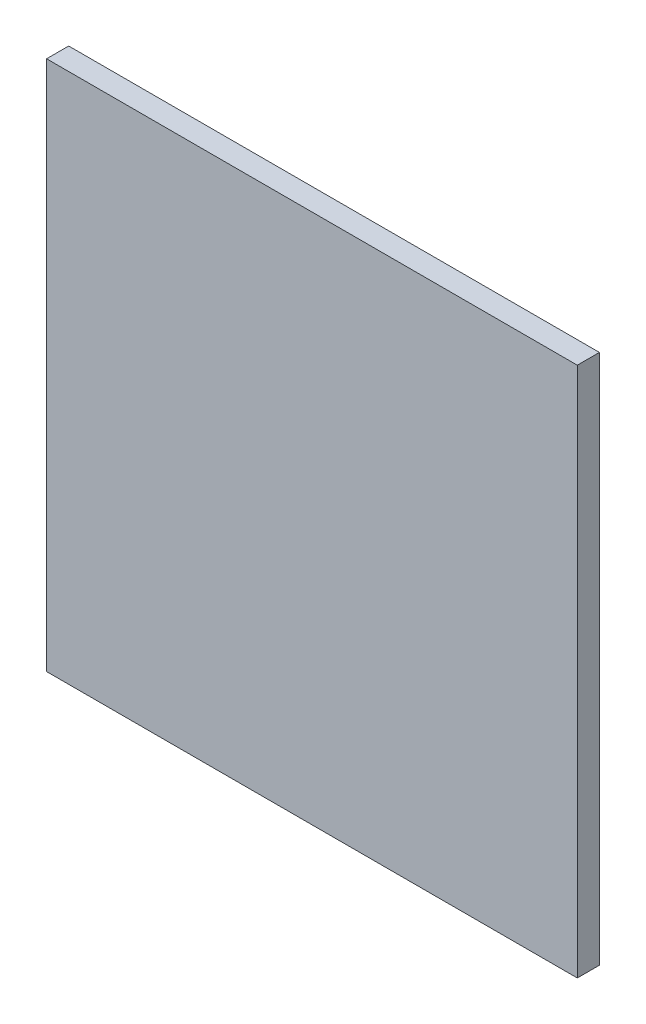
ISO-10303-21;
HEADER;
FILE_DESCRIPTION(('STEP AP214'),'2;1');
FILE_NAME('part.step','',(''),(''),'','','');
FILE_SCHEMA(('AUTOMOTIVE_DESIGN { 1 0 10303 214 1 1 1 1 }'));
ENDSEC;
DATA;
#1=APPLICATION_CONTEXT('core data for automotive mechanical design processes');
#2=APPLICATION_PROTOCOL_DEFINITION('international standard','automotive_design',2000,#1);
#3=PRODUCT_CONTEXT('',#1,'mechanical');
#4=PRODUCT('Part','Part','',(#3));
#5=PRODUCT_RELATED_PRODUCT_CATEGORY('part','',(#4));
#6=PRODUCT_DEFINITION_FORMATION('','',#4);
#7=PRODUCT_DEFINITION_CONTEXT('part definition',#1,'design');
#8=PRODUCT_DEFINITION('design','',#6,#7);
#9=PRODUCT_DEFINITION_SHAPE('','',#8);
#10=(LENGTH_UNIT() NAMED_UNIT(*) SI_UNIT(.MILLI.,.METRE.));
#11=(NAMED_UNIT(*) PLANE_ANGLE_UNIT() SI_UNIT($,.RADIAN.));
#12=(NAMED_UNIT(*) SI_UNIT($,.STERADIAN.) SOLID_ANGLE_UNIT());
#13=UNCERTAINTY_MEASURE_WITH_UNIT(LENGTH_MEASURE(1.E-05),#10,'distance_accuracy_value','');
#14=(GEOMETRIC_REPRESENTATION_CONTEXT(3) GLOBAL_UNCERTAINTY_ASSIGNED_CONTEXT((#13)) GLOBAL_UNIT_ASSIGNED_CONTEXT((#10,
#11,#12)) REPRESENTATION_CONTEXT('',''));
#15=CARTESIAN_POINT('',(0.,0.,0.));
#16=DIRECTION('',(0.,0.,1.));
#17=DIRECTION('',(1.,0.,0.));
#18=AXIS2_PLACEMENT_3D('',#15,#16,#17);
#19=CARTESIAN_POINT('',(-30.,-30.,2.5));
#20=DIRECTION('',(0.,1.,0.));
#21=DIRECTION('',(0.,0.,1.));
#22=AXIS2_PLACEMENT_3D('',#19,#20,#21);
#23=PLANE('',#22);
#24=DIRECTION('',(1.,0.,0.));
#25=VECTOR('',#24,1.);
#26=CARTESIAN_POINT('',(-30.,-30.,0.));
#27=LINE('',#26,#25);
#28=CARTESIAN_POINT('',(-30.,-30.,0.));
#29=VERTEX_POINT('',#28);
#30=CARTESIAN_POINT('',(30.,-30.,0.));
#31=VERTEX_POINT('',#30);
#32=EDGE_CURVE('E96',#29,#31,#27,.T.);
#33=ORIENTED_EDGE('',*,*,#32,.T.);
#34=DIRECTION('',(0.,0.,-1.));
#35=VECTOR('',#34,1.);
#36=CARTESIAN_POINT('',(30.,-30.,2.5));
#37=LINE('',#36,#35);
#38=CARTESIAN_POINT('',(30.,-30.,2.5));
#39=VERTEX_POINT('',#38);
#40=EDGE_CURVE('E11',#39,#31,#37,.T.);
#41=ORIENTED_EDGE('',*,*,#40,.F.);
#42=DIRECTION('',(1.,0.,0.));
#43=VECTOR('',#42,1.);
#44=CARTESIAN_POINT('',(-30.,-30.,2.5));
#45=LINE('',#44,#43);
#46=CARTESIAN_POINT('',(-30.,-30.,2.5));
#47=VERTEX_POINT('',#46);
#48=EDGE_CURVE('E84',#47,#39,#45,.T.);
#49=ORIENTED_EDGE('',*,*,#48,.F.);
#50=DIRECTION('',(0.,0.,-1.));
#51=VECTOR('',#50,1.);
#52=CARTESIAN_POINT('',(-30.,-30.,2.5));
#53=LINE('',#52,#51);
#54=EDGE_CURVE('E92',#47,#29,#53,.T.);
#55=ORIENTED_EDGE('',*,*,#54,.T.);
#56=EDGE_LOOP('',(#33,#41,#49,#55));
#57=FACE_BOUND('',#56,.T.);
#58=ADVANCED_FACE('F33',(#57),#23,.F.);
#59=CARTESIAN_POINT('',(30.,30.,2.5));
#60=DIRECTION('',(-1.,0.,0.));
#61=DIRECTION('',(0.,-1.,0.));
#62=AXIS2_PLACEMENT_3D('',#59,#60,#61);
#63=PLANE('',#62);
#64=DIRECTION('',(0.,1.,0.));
#65=VECTOR('',#64,1.);
#66=CARTESIAN_POINT('',(30.,30.,0.));
#67=LINE('',#66,#65);
#68=CARTESIAN_POINT('',(30.,30.,0.));
#69=VERTEX_POINT('',#68);
#70=EDGE_CURVE('E88',#31,#69,#67,.T.);
#71=ORIENTED_EDGE('',*,*,#70,.T.);
#72=DIRECTION('',(0.,0.,-1.));
#73=VECTOR('',#72,1.);
#74=CARTESIAN_POINT('',(30.,30.,2.5));
#75=LINE('',#74,#73);
#76=CARTESIAN_POINT('',(30.,30.,2.5));
#77=VERTEX_POINT('',#76);
#78=EDGE_CURVE('E41',#77,#69,#75,.T.);
#79=ORIENTED_EDGE('',*,*,#78,.F.);
#80=DIRECTION('',(0.,1.,0.));
#81=VECTOR('',#80,1.);
#82=CARTESIAN_POINT('',(30.,30.,2.5));
#83=LINE('',#82,#81);
#84=EDGE_CURVE('E79',#39,#77,#83,.T.);
#85=ORIENTED_EDGE('',*,*,#84,.F.);
#86=ORIENTED_EDGE('',*,*,#40,.T.);
#87=EDGE_LOOP('',(#71,#79,#85,#86));
#88=FACE_BOUND('',#87,.T.);
#89=ADVANCED_FACE('F87',(#88),#63,.F.);
#90=CARTESIAN_POINT('',(-30.,30.,2.5));
#91=DIRECTION('',(0.,-1.,0.));
#92=DIRECTION('',(0.,0.,-1.));
#93=AXIS2_PLACEMENT_3D('',#90,#91,#92);
#94=PLANE('',#93);
#95=DIRECTION('',(-1.,0.,0.));
#96=VECTOR('',#95,1.);
#97=CARTESIAN_POINT('',(-30.,30.,0.));
#98=LINE('',#97,#96);
#99=CARTESIAN_POINT('',(-30.,30.,0.));
#100=VERTEX_POINT('',#99);
#101=EDGE_CURVE('E66',#69,#100,#98,.T.);
#102=ORIENTED_EDGE('',*,*,#101,.T.);
#103=DIRECTION('',(0.,0.,-1.));
#104=VECTOR('',#103,1.);
#105=CARTESIAN_POINT('',(-30.,30.,2.5));
#106=LINE('',#105,#104);
#107=CARTESIAN_POINT('',(-30.,30.,2.5));
#108=VERTEX_POINT('',#107);
#109=EDGE_CURVE('E89',#108,#100,#106,.T.);
#110=ORIENTED_EDGE('',*,*,#109,.F.);
#111=DIRECTION('',(-1.,0.,0.));
#112=VECTOR('',#111,1.);
#113=CARTESIAN_POINT('',(-30.,30.,2.5));
#114=LINE('',#113,#112);
#115=EDGE_CURVE('E82',#77,#108,#114,.T.);
#116=ORIENTED_EDGE('',*,*,#115,.F.);
#117=ORIENTED_EDGE('',*,*,#78,.T.);
#118=EDGE_LOOP('',(#102,#110,#116,#117));
#119=FACE_BOUND('',#118,.T.);
#120=ADVANCED_FACE('F90',(#119),#94,.F.);
#121=CARTESIAN_POINT('',(-30.,30.,2.5));
#122=DIRECTION('',(1.,0.,0.));
#123=DIRECTION('',(0.,1.,0.));
#124=AXIS2_PLACEMENT_3D('',#121,#122,#123);
#125=PLANE('',#124);
#126=DIRECTION('',(0.,-1.,0.));
#127=VECTOR('',#126,1.);
#128=CARTESIAN_POINT('',(-30.,30.,0.));
#129=LINE('',#128,#127);
#130=EDGE_CURVE('E72',#100,#29,#129,.T.);
#131=ORIENTED_EDGE('',*,*,#130,.T.);
#132=ORIENTED_EDGE('',*,*,#54,.F.);
#133=DIRECTION('',(0.,-1.,0.));
#134=VECTOR('',#133,1.);
#135=CARTESIAN_POINT('',(-30.,30.,2.5));
#136=LINE('',#135,#134);
#137=EDGE_CURVE('E49',#108,#47,#136,.T.);
#138=ORIENTED_EDGE('',*,*,#137,.F.);
#139=ORIENTED_EDGE('',*,*,#109,.T.);
#140=EDGE_LOOP('',(#131,#132,#138,#139));
#141=FACE_BOUND('',#140,.T.);
#142=ADVANCED_FACE('F103',(#141),#125,.F.);
#143=CARTESIAN_POINT('',(0.,0.,2.5));
#144=DIRECTION('',(0.,0.,-1.));
#145=DIRECTION('',(-1.,0.,0.));
#146=AXIS2_PLACEMENT_3D('',#143,#144,#145);
#147=PLANE('',#146);
#148=ORIENTED_EDGE('',*,*,#48,.T.);
#149=ORIENTED_EDGE('',*,*,#84,.T.);
#150=ORIENTED_EDGE('',*,*,#115,.T.);
#151=ORIENTED_EDGE('',*,*,#137,.T.);
#152=EDGE_LOOP('',(#148,#149,#150,#151));
#153=FACE_BOUND('',#152,.T.);
#154=ADVANCED_FACE('F80',(#153),#147,.F.);
#155=CARTESIAN_POINT('',(0.,0.,0.));
#156=DIRECTION('',(0.,0.,-1.));
#157=DIRECTION('',(-1.,0.,0.));
#158=AXIS2_PLACEMENT_3D('',#155,#156,#157);
#159=PLANE('',#158);
#160=ORIENTED_EDGE('',*,*,#32,.F.);
#161=ORIENTED_EDGE('',*,*,#130,.F.);
#162=ORIENTED_EDGE('',*,*,#101,.F.);
#163=ORIENTED_EDGE('',*,*,#70,.F.);
#164=EDGE_LOOP('',(#160,#161,#162,#163));
#165=FACE_BOUND('',#164,.T.);
#166=ADVANCED_FACE('F106',(#165),#159,.T.);
#167=CLOSED_SHELL('',(#58,#89,#120,#142,#154,#166));
#168=MANIFOLD_SOLID_BREP('B2',#167);
#169=ADVANCED_BREP_SHAPE_REPRESENTATION('',(#18,#168),#14);
#170=SHAPE_DEFINITION_REPRESENTATION(#9,#169);
ENDSEC;
END-ISO-10303-21;
